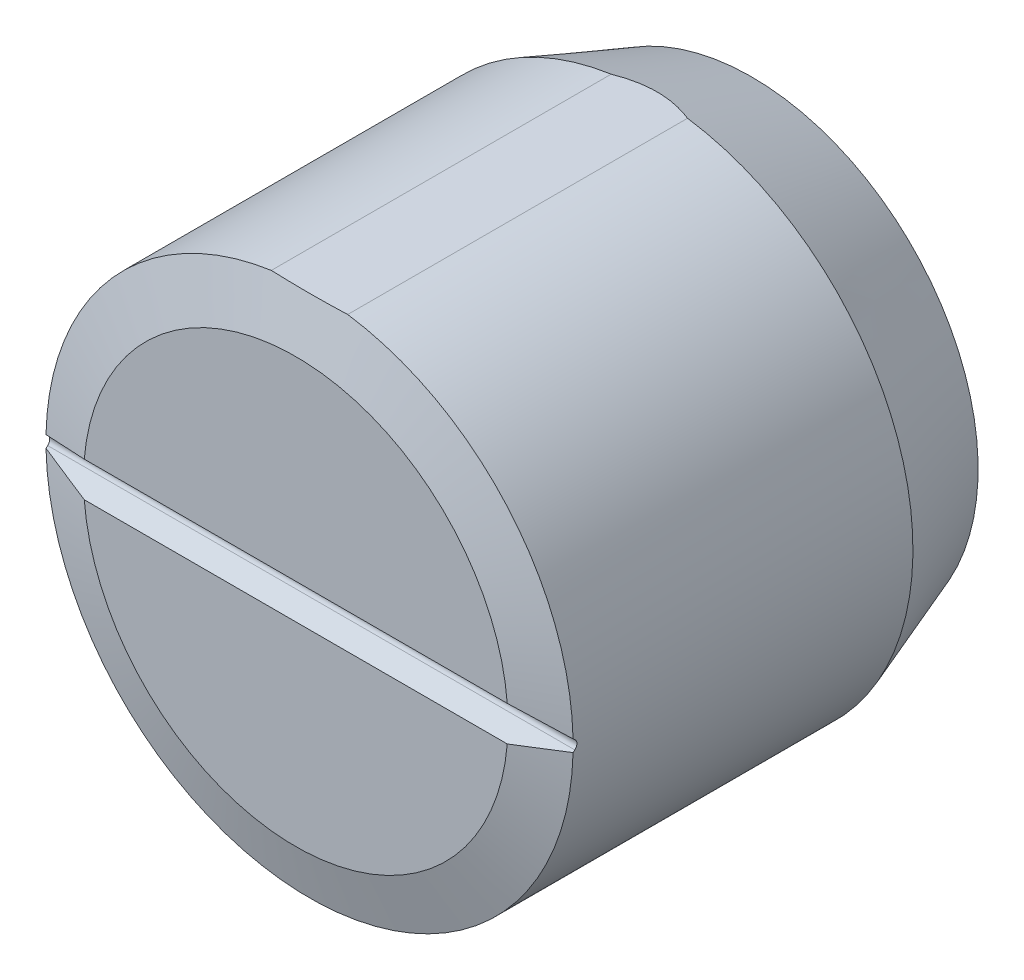
ISO-10303-21;
HEADER;
FILE_DESCRIPTION(('STEP AP214'),'2;1');
FILE_NAME('part.step','',(''),(''),'','','');
FILE_SCHEMA(('AUTOMOTIVE_DESIGN { 1 0 10303 214 1 1 1 1 }'));
ENDSEC;
DATA;
#1=APPLICATION_CONTEXT('core data for automotive mechanical design processes');
#2=APPLICATION_PROTOCOL_DEFINITION('international standard','automotive_design',2000,#1);
#3=PRODUCT_CONTEXT('',#1,'mechanical');
#4=PRODUCT('Part','Part','',(#3));
#5=PRODUCT_RELATED_PRODUCT_CATEGORY('part','',(#4));
#6=PRODUCT_DEFINITION_FORMATION('','',#4);
#7=PRODUCT_DEFINITION_CONTEXT('part definition',#1,'design');
#8=PRODUCT_DEFINITION('design','',#6,#7);
#9=PRODUCT_DEFINITION_SHAPE('','',#8);
#10=(LENGTH_UNIT() NAMED_UNIT(*) SI_UNIT(.MILLI.,.METRE.));
#11=(NAMED_UNIT(*) PLANE_ANGLE_UNIT() SI_UNIT($,.RADIAN.));
#12=(NAMED_UNIT(*) SI_UNIT($,.STERADIAN.) SOLID_ANGLE_UNIT());
#13=UNCERTAINTY_MEASURE_WITH_UNIT(LENGTH_MEASURE(1.E-05),#10,'distance_accuracy_value','');
#14=(GEOMETRIC_REPRESENTATION_CONTEXT(3) GLOBAL_UNCERTAINTY_ASSIGNED_CONTEXT((#13)) GLOBAL_UNIT_ASSIGNED_CONTEXT((#10,
#11,#12)) REPRESENTATION_CONTEXT('',''));
#15=CARTESIAN_POINT('',(0.,0.,0.));
#16=DIRECTION('',(0.,0.,1.));
#17=DIRECTION('',(1.,0.,0.));
#18=AXIS2_PLACEMENT_3D('',#15,#16,#17);
#19=CARTESIAN_POINT('',(0.,0.,15.1097491672833));
#20=DIRECTION('',(0.,0.,-1.));
#21=DIRECTION('',(-1.,0.,0.));
#22=AXIS2_PLACEMENT_3D('',#19,#20,#21);
#23=CONICAL_SURFACE('',#22,9.005,1.30899693899575);
#24=CARTESIAN_POINT('',(7.22436673413913,-0.600169059892802,15.5802));
#25=CARTESIAN_POINT('',(7.37277091732223,-0.567286950602729,15.5413000470452));
#26=CARTESIAN_POINT('',(7.52113153517502,-0.534323016319418,15.5023032940839));
#27=CARTESIAN_POINT('',(7.81777667592504,-0.468253253207628,15.4241419251118));
#28=CARTESIAN_POINT('',(7.96606119894645,-0.435147424611528,15.3849773093759));
#29=CARTESIAN_POINT('',(8.26256560088161,-0.368815536324618,15.3065058429919));
#30=CARTESIAN_POINT('',(8.41078547982616,-0.335589476691132,15.2671989924117));
#31=CARTESIAN_POINT('',(8.70716930626139,-0.269033044658679,15.1884618879247));
#32=CARTESIAN_POINT('',(8.8553332536603,-0.235702672089384,15.1490316338163));
#33=CARTESIAN_POINT('',(9.00347331411797,-0.202328164385701,15.1095491672834));
#34=B_SPLINE_CURVE_WITH_KNOTS('',3,(#24,#25,#26,#27,#28,#29,#30,#31,#32,#33),.UNSPECIFIED.,.F.,
.F.,(4,2,2,2,4),(0.,0.47070589152241,0.941411012469635,1.41211590901461,1.88282157454915),.UNSPECIFIED.);
#35=CARTESIAN_POINT('',(7.22512975662029,-0.600000000000045,15.58));
#36=VERTEX_POINT('',#35);
#37=CARTESIAN_POINT('',(9.00272291443868,-0.202497224278021,15.1097491672834));
#38=VERTEX_POINT('',#37);
#39=EDGE_CURVE('E196',#36,#38,#34,.T.);
#40=ORIENTED_EDGE('',*,*,#39,.F.);
#41=CARTESIAN_POINT('',(0.,0.,15.58));
#42=DIRECTION('',(0.,0.,-1.));
#43=DIRECTION('',(-1.,0.,0.));
#44=AXIS2_PLACEMENT_3D('',#41,#42,#43);
#45=CIRCLE('',#44,7.25);
#46=CARTESIAN_POINT('',(-7.22512975662029,-0.600000000000045,15.58));
#47=VERTEX_POINT('',#46);
#48=EDGE_CURVE('E241',#36,#47,#45,.T.);
#49=ORIENTED_EDGE('',*,*,#48,.T.);
#50=CARTESIAN_POINT('',(-9.00347331411791,-0.202328164385708,15.1095491672834));
#51=CARTESIAN_POINT('',(-8.85533325366024,-0.235702672089404,15.1490316338164));
#52=CARTESIAN_POINT('',(-8.70716930626131,-0.269033044658702,15.1884618879247));
#53=CARTESIAN_POINT('',(-8.41078547982606,-0.335589476691159,15.2671989924117));
#54=CARTESIAN_POINT('',(-8.26256560088149,-0.368815536324644,15.306505842992));
#55=CARTESIAN_POINT('',(-7.9660611989463,-0.435147424611569,15.3849773093759));
#56=CARTESIAN_POINT('',(-7.81777667592489,-0.468253253207683,15.4241419251118));
#57=CARTESIAN_POINT('',(-7.52113153517483,-0.534323016319447,15.5023032940839));
#58=CARTESIAN_POINT('',(-7.37277091732201,-0.567286950602718,15.5413000470453));
#59=CARTESIAN_POINT('',(-7.22436673413887,-0.600169059892687,15.5802000000001));
#60=B_SPLINE_CURVE_WITH_KNOTS('',3,(#50,#51,#52,#53,#54,#55,#56,#57,#58,#59),.UNSPECIFIED.,.F.,
.F.,(4,2,2,2,4),(0.,0.470705665534585,0.941410562079602,1.41211568302687,1.88282157454933),.UNSPECIFIED.);
#61=CARTESIAN_POINT('',(-9.00272291443868,-0.202497224277896,15.1097491672834));
#62=VERTEX_POINT('',#61);
#63=EDGE_CURVE('E190',#62,#47,#60,.T.);
#64=ORIENTED_EDGE('',*,*,#63,.F.);
#65=CARTESIAN_POINT('',(0.,0.,15.1097491672833));
#66=DIRECTION('',(0.,0.,-1.));
#67=DIRECTION('',(-1.,0.,0.));
#68=AXIS2_PLACEMENT_3D('',#65,#66,#67);
#69=CIRCLE('',#68,9.005);
#70=EDGE_CURVE('E128',#38,#62,#69,.T.);
#71=ORIENTED_EDGE('',*,*,#70,.F.);
#72=EDGE_LOOP('',(#40,#49,#64,#71));
#73=FACE_BOUND('',#72,.T.);
#74=ADVANCED_FACE('F41',(#73),#23,.T.);
#75=CARTESIAN_POINT('',(0.,7.24999999999997,15.58));
#76=DIRECTION('',(0.,0.,1.));
#77=DIRECTION('',(1.,0.,0.));
#78=AXIS2_PLACEMENT_3D('',#75,#76,#77);
#79=PLANE('',#78);
#80=DIRECTION('',(1.,0.,0.));
#81=VECTOR('',#80,1.);
#82=CARTESIAN_POINT('',(1.38777878078145E-13,-0.600000000000047,15.58));
#83=LINE('',#82,#81);
#84=EDGE_CURVE('E141',#47,#36,#83,.T.);
#85=ORIENTED_EDGE('',*,*,#84,.F.);
#86=ORIENTED_EDGE('',*,*,#48,.F.);
#87=EDGE_LOOP('',(#85,#86));
#88=FACE_BOUND('',#87,.T.);
#89=ADVANCED_FACE('F169',(#88),#79,.T.);
#90=CARTESIAN_POINT('',(0.,0.,0.));
#91=DIRECTION('',(0.,0.,-1.));
#92=DIRECTION('',(-1.,0.,0.));
#93=AXIS2_PLACEMENT_3D('',#90,#91,#92);
#94=PLANE('',#93);
#95=CARTESIAN_POINT('',(0.,0.,0.));
#96=DIRECTION('',(0.,0.,-1.));
#97=DIRECTION('',(-1.,0.,0.));
#98=AXIS2_PLACEMENT_3D('',#95,#96,#97);
#99=CIRCLE('',#98,7.73110418006829);
#100=CARTESIAN_POINT('',(-7.73110418006829,0.,0.));
#101=VERTEX_POINT('',#100);
#102=EDGE_CURVE('E136',#101,#101,#99,.T.);
#103=ORIENTED_EDGE('',*,*,#102,.T.);
#104=EDGE_LOOP('',(#103));
#105=FACE_BOUND('',#104,.T.);
#106=ADVANCED_FACE('F43',(#105),#94,.T.);
#107=CARTESIAN_POINT('',(0.,0.,0.));
#108=DIRECTION('',(0.,0.,1.));
#109=DIRECTION('',(1.,0.,0.));
#110=AXIS2_PLACEMENT_3D('',#107,#108,#109);
#111=CONICAL_SURFACE('',#110,7.73110418006829,0.349065850398866);
#112=CARTESIAN_POINT('',(-9.85202668718935,8.90999999999997,15.2549950201081));
#113=CARTESIAN_POINT('',(-9.73832319972021,8.90999999999997,15.0233033635091));
#114=CARTESIAN_POINT('',(-9.62391155739797,8.90999999999997,14.7919596300944));
#115=CARTESIAN_POINT('',(-9.39351714811486,8.90999999999997,14.3300512492619));
#116=CARTESIAN_POINT('',(-9.27753435506669,8.90999999999997,14.0994866148598));
#117=CARTESIAN_POINT('',(-8.92685090006894,8.90999999999997,13.4087987432727));
#118=CARTESIAN_POINT('',(-8.68956250736841,8.90999999999997,12.9499828200869));
#119=CARTESIAN_POINT('',(-8.20060385893398,8.90999999999998,12.0256592580023));
#120=CARTESIAN_POINT('',(-7.94872380468047,8.90999999999998,11.560262364858));
#121=CARTESIAN_POINT('',(-7.43385267489679,8.90999999999997,10.6358822500702));
#122=CARTESIAN_POINT('',(-7.17086666895079,8.90999999999996,10.1768962266744));
#123=CARTESIAN_POINT('',(-6.76535956781045,8.90999999999996,9.49473418767664));
#124=CARTESIAN_POINT('',(-6.62829643636828,8.90999999999997,9.26831186109794));
#125=CARTESIAN_POINT('',(-6.34994703769146,8.90999999999998,8.81808223552854));
#126=CARTESIAN_POINT('',(-6.20866092485748,8.90999999999997,8.5942748413458));
#127=CARTESIAN_POINT('',(-5.92097157982445,8.90999999999997,8.14950677044353));
#128=CARTESIAN_POINT('',(-5.77456125477976,8.90999999999997,7.92855066981121));
#129=CARTESIAN_POINT('',(-5.47596266356686,8.90999999999997,7.49058140838202));
#130=CARTESIAN_POINT('',(-5.32377472019753,8.90999999999997,7.27356802830179));
#131=CARTESIAN_POINT('',(-5.01392904483775,8.90999999999997,6.84643405707593));
#132=CARTESIAN_POINT('',(-4.85633283274131,8.90999999999997,6.6362690218073));
#133=CARTESIAN_POINT('',(-4.53300430930162,8.90999999999997,6.22216362081104));
#134=CARTESIAN_POINT('',(-4.36726988149461,8.90999999999997,6.01822489693125));
#135=CARTESIAN_POINT('',(-4.0264197882344,8.90999999999998,5.61918378235192));
#136=CARTESIAN_POINT('',(-3.85132886658601,8.90999999999998,5.42406038051527));
#137=CARTESIAN_POINT('',(-3.48930678484745,8.90999999999997,5.04520548421845));
#138=CARTESIAN_POINT('',(-3.30238425872756,8.90999999999995,4.86146587198599));
#139=CARTESIAN_POINT('',(-2.99532846896235,8.90999999999996,4.58361534765137));
#140=CARTESIAN_POINT('',(-2.88000580395285,8.90999999999997,4.48419248007644));
#141=CARTESIAN_POINT('',(-2.64380689821424,8.90999999999998,4.29204537322492));
#142=CARTESIAN_POINT('',(-2.52292893341572,8.90999999999997,4.19932323678034));
#143=CARTESIAN_POINT('',(-2.27554440435997,8.90999999999997,4.02261351873669));
#144=CARTESIAN_POINT('',(-2.14905923393758,8.90999999999998,3.93859623633899));
#145=CARTESIAN_POINT('',(-1.88973687463504,8.90999999999997,3.78111428422171));
#146=CARTESIAN_POINT('',(-1.7569040821598,8.90999999999996,3.70764244790472));
#147=CARTESIAN_POINT('',(-1.48044368533272,8.90999999999996,3.57170985264807));
#148=CARTESIAN_POINT('',(-1.33660855004627,8.90999999999997,3.50966439367904));
#149=CARTESIAN_POINT('',(-1.04251610703517,8.90999999999997,3.40273344604548));
#150=CARTESIAN_POINT('',(-0.892255136338415,8.90999999999996,3.35785789384378));
#151=CARTESIAN_POINT('',(-0.557078419023284,8.90999999999996,3.28172247812343));
#152=CARTESIAN_POINT('',(-0.371126019999049,8.90999999999997,3.25483361048744));
#153=CARTESIAN_POINT('',(0.00256491954699891,8.90999999999997,3.23361621423221));
#154=CARTESIAN_POINT('',(0.190302361130124,8.90999999999996,3.23926880280079));
#155=CARTESIAN_POINT('',(0.561520598463996,8.90999999999996,3.28226514230495));
#156=CARTESIAN_POINT('',(0.745010647559128,8.90999999999998,3.31953167704147));
#157=CARTESIAN_POINT('',(1.10413489125104,8.90999999999997,3.4213376981751));
#158=CARTESIAN_POINT('',(1.27976537263831,8.90999999999996,3.48588992821065));
#159=CARTESIAN_POINT('',(1.59125567250086,8.90999999999996,3.62338556021646));
#160=CARTESIAN_POINT('',(1.7286865675411,8.90999999999997,3.69286920531092));
#161=CARTESIAN_POINT('',(1.99694628939248,8.90999999999998,3.84369744549519));
#162=CARTESIAN_POINT('',(2.12777037730051,8.90999999999997,3.925050395952));
#163=CARTESIAN_POINT('',(2.3842848357777,8.90999999999997,4.09799143261248));
#164=CARTESIAN_POINT('',(2.50991181302054,8.90999999999998,4.18967259103326));
#165=CARTESIAN_POINT('',(2.75515148065709,8.90999999999998,4.38059571683231));
#166=CARTESIAN_POINT('',(2.87476654607346,8.90999999999997,4.47983465889021));
#167=CARTESIAN_POINT('',(3.16745439357251,8.90999999999997,4.73578818181259));
#168=CARTESIAN_POINT('',(3.33717984327115,8.90999999999998,4.89632184015375));
#169=CARTESIAN_POINT('',(3.66662022917599,8.90999999999998,5.22741695244774));
#170=CARTESIAN_POINT('',(3.82632893444507,8.90999999999998,5.39798452266247));
#171=CARTESIAN_POINT('',(4.13784101034586,8.90999999999998,5.7471876610858));
#172=CARTESIAN_POINT('',(4.28961580244509,8.90999999999998,5.92584857660066));
#173=CARTESIAN_POINT('',(4.58606344684487,8.90999999999998,6.2889752225291));
#174=CARTESIAN_POINT('',(4.73073534625432,8.90999999999997,6.47344172637559));
#175=CARTESIAN_POINT('',(5.00540129919298,8.90999999999998,6.83551476718275));
#176=CARTESIAN_POINT('',(5.13575209384709,8.90999999999998,7.01285187600863));
#177=CARTESIAN_POINT('',(5.39189163321045,8.90999999999997,7.37080626547569));
#178=CARTESIAN_POINT('',(5.51767997069381,8.90999999999996,7.55142383676858));
#179=CARTESIAN_POINT('',(5.76424386805758,8.90999999999999,7.913809677761));
#180=CARTESIAN_POINT('',(5.88505282803088,8.91000000000002,8.09555529294848));
#181=CARTESIAN_POINT('',(6.12321065489872,8.90999999999993,8.46123546189821));
#182=CARTESIAN_POINT('',(6.24056040168765,8.90999999999981,8.64516944201943));
#183=CARTESIAN_POINT('',(6.35643071534644,8.90999999999952,8.83001663249682));
#184=B_SPLINE_CURVE_WITH_KNOTS('',3,(#112,#113,#114,#115,#116,#117,#118,#119,#120,#121,#122,
#123,#124,#125,#126,#127,#128,#129,#130,#131,#132,#133,#134,#135,#136,#137,#138,#139,#140,#141,
#142,#143,#144,#145,#146,#147,#148,#149,#150,#151,#152,#153,#154,#155,#156,#157,#158,#159,#160,
#161,#162,#163,#164,#165,#166,#167,#168,#169,#170,#171,#172,#173,#174,#175,#176,#177,#178,#179,
#180,#181,#182,#183),.UNSPECIFIED.,.F.,.F.,(4,2,2,2,2,2,2,2,2,2,2,2,2,2,2,2,2,2,2,2,2,2,2,2,2,2,
2,2,2,2,2,2,2,2,2,4),(0.,0.774261954853833,1.5485367813076,3.09809249411595,4.68554241127188,
6.27227536913526,7.06626668493813,7.86022900625234,8.65533752692978,9.45040168962319,
10.2383137062572,11.0264317277016,11.812559788227,12.5981206513432,13.0547152544709,
13.5114525299999,13.9665762102659,14.4213891127385,14.8903989993721,15.359679899459,
15.9206144412045,16.4812235226049,17.0404672610214,17.5999724803454,18.0613046928323,
18.5229632400234,18.9891771041258,19.4552053176551,20.1554565662914,20.8561391736347,
21.5591927336377,22.2623403557505,22.9225292492604,23.5827769241947,24.2374400786621,
24.8919352486842),.UNSPECIFIED.);
#185=CARTESIAN_POINT('',(1.30457847598361,8.90999999999952,3.49999999999995));
#186=VERTEX_POINT('',#185);
#187=CARTESIAN_POINT('',(-1.30457847598378,8.90999999999996,3.49999999999995));
#188=VERTEX_POINT('',#187);
#189=EDGE_CURVE('E211',#186,#188,#184,.F.);
#190=ORIENTED_EDGE('',*,*,#189,.F.);
#191=CARTESIAN_POINT('',(0.,0.,3.49999999999995));
#192=DIRECTION('',(0.,0.,-1.));
#193=DIRECTION('',(-1.,0.,0.));
#194=AXIS2_PLACEMENT_3D('',#191,#192,#193);
#195=CIRCLE('',#194,9.005);
#196=EDGE_CURVE('E123',#186,#188,#195,.T.);
#197=ORIENTED_EDGE('',*,*,#196,.T.);
#198=EDGE_LOOP('',(#190,#197));
#199=FACE_BOUND('',#198,.T.);
#200=ORIENTED_EDGE('',*,*,#102,.F.);
#201=EDGE_LOOP('',(#200));
#202=FACE_BOUND('',#201,.T.);
#203=ADVANCED_FACE('F220',(#199,#202),#111,.T.);
#204=CARTESIAN_POINT('',(0.,0.,0.));
#205=DIRECTION('',(0.,0.,-1.));
#206=DIRECTION('',(-1.,0.,0.));
#207=AXIS2_PLACEMENT_3D('',#204,#205,#206);
#208=CYLINDRICAL_SURFACE('',#207,9.005);
#209=DIRECTION('',(0.,0.,-1.));
#210=VECTOR('',#209,1.);
#211=CARTESIAN_POINT('',(-1.30457847598378,8.90999999999997,0.));
#212=LINE('',#211,#210);
#213=CARTESIAN_POINT('',(-1.30457847598378,8.90999999999997,15.1097491672834));
#214=VERTEX_POINT('',#213);
#215=EDGE_CURVE('E61',#188,#214,#212,.F.);
#216=ORIENTED_EDGE('',*,*,#215,.F.);
#217=ORIENTED_EDGE('',*,*,#196,.F.);
#218=DIRECTION('',(0.,0.,-1.));
#219=VECTOR('',#218,1.);
#220=CARTESIAN_POINT('',(1.30457847598367,8.90999999999952,0.));
#221=LINE('',#220,#219);
#222=CARTESIAN_POINT('',(1.30457847598361,8.90999999999952,15.1097491672837));
#223=VERTEX_POINT('',#222);
#224=EDGE_CURVE('E111',#223,#186,#221,.T.);
#225=ORIENTED_EDGE('',*,*,#224,.F.);
#226=CARTESIAN_POINT('',(9.00272291443874,0.202497224277898,15.1097491672834));
#227=VERTEX_POINT('',#226);
#228=EDGE_CURVE('E121',#223,#227,#69,.T.);
#229=ORIENTED_EDGE('',*,*,#228,.T.);
#230=CARTESIAN_POINT('',(0.,0.,14.8701923788647));
#231=DIRECTION('',(0.,0.763707940790422,-0.645561911185635));
#232=DIRECTION('',(0.,-0.645561911185634,-0.763707940790424));
#233=AXIS2_PLACEMENT_3D('',#230,#231,#232);
#234=ELLIPSE('',#233,13.9490881416183,9.005);
#235=CARTESIAN_POINT('',(9.00370451576718,0.152741588158136,15.0508876177629));
#236=VERTEX_POINT('',#235);
#237=EDGE_CURVE('E250',#236,#227,#234,.F.);
#238=ORIENTED_EDGE('',*,*,#237,.F.);
#239=CARTESIAN_POINT('',(9.00370451576718,-0.152741588158152,15.0508876177629));
#240=CARTESIAN_POINT('',(9.00382785449455,-0.145485461516833,15.0422887523417));
#241=CARTESIAN_POINT('',(9.00395448059267,-0.137491962043754,15.03431694995));
#242=CARTESIAN_POINT('',(9.00420056491583,-0.120290631982083,15.0198266527458));
#243=CARTESIAN_POINT('',(9.00432002822644,-0.111083678159597,15.0133071176796));
#244=CARTESIAN_POINT('',(9.0045383108549,-0.0917002537795633,15.0019050095292));
#245=CARTESIAN_POINT('',(9.00463712068713,-0.0815233408546724,14.9970231879857));
#246=CARTESIAN_POINT('',(9.00480291510115,-0.060496368130665,14.9890377764883));
#247=CARTESIAN_POINT('',(9.00486990557044,-0.04964643328004,14.9859338575502));
#248=CARTESIAN_POINT('',(9.0049645208678,-0.0275800666279605,14.9815918532155));
#249=CARTESIAN_POINT('',(9.00499214876594,-0.0163636634788681,14.9803536223047));
#250=CARTESIAN_POINT('',(9.00500493720603,0.00611850463255241,14.9797776033208));
#251=CARTESIAN_POINT('',(9.00499009532122,0.0173842723788772,14.9804399238464));
#252=CARTESIAN_POINT('',(9.00491962768836,0.0396400122364273,14.9836456523517));
#253=CARTESIAN_POINT('',(9.00486401844282,0.0506300940833742,14.9861882991842));
#254=CARTESIAN_POINT('',(9.00471826192663,0.072032396876099,14.9930835651275));
#255=CARTESIAN_POINT('',(9.00462809983383,0.0824443676316984,14.9974369610649));
#256=CARTESIAN_POINT('',(9.00442332477357,0.10239823098556,15.007833262838));
#257=CARTESIAN_POINT('',(9.0043086881504,0.111939268960968,15.013877805008));
#258=CARTESIAN_POINT('',(9.00406813559458,0.12985439208539,15.0274753259705));
#259=CARTESIAN_POINT('',(9.00394224438615,0.138230936702547,15.0350250410108));
#260=CARTESIAN_POINT('',(9.0037798613365,0.14825239835924,15.0457125926853));
#261=CARTESIAN_POINT('',(9.00374201595107,0.150531413772268,15.0482720862612));
#262=CARTESIAN_POINT('',(9.00370451576718,0.152741588158136,15.0508876177629));
#263=B_SPLINE_CURVE_WITH_KNOTS('',3,(#239,#240,#241,#242,#243,#244,#245,#246,#247,#248,#249,
#250,#251,#252,#253,#254,#255,#256,#257,#258,#259,#260,#261,#262),.UNSPECIFIED.,.F.,.F.,(4,2,2,
2,2,2,2,2,2,2,2,4),(0.,0.0337111285118475,0.0673980316557301,0.101100372513311,
0.134796475051494,0.168489949331306,0.202185348915176,0.235867116221424,0.269563348216738,
0.303292297744346,0.336948891100301,0.34722579177601),.UNSPECIFIED.);
#264=CARTESIAN_POINT('',(9.00370451576724,-0.152741588158159,15.0508876177629));
#265=VERTEX_POINT('',#264);
#266=EDGE_CURVE('E143',#265,#236,#263,.T.);
#267=ORIENTED_EDGE('',*,*,#266,.F.);
#268=CARTESIAN_POINT('',(0.,0.,14.8701923788647));
#269=DIRECTION('',(0.,-0.76370794079042,-0.645561911185638));
#270=DIRECTION('',(0.,0.645561911185636,-0.763707940790422));
#271=AXIS2_PLACEMENT_3D('',#268,#269,#270);
#272=ELLIPSE('',#271,13.9490881416183,9.005);
#273=EDGE_CURVE('E201',#38,#265,#272,.F.);
#274=ORIENTED_EDGE('',*,*,#273,.F.);
#275=ORIENTED_EDGE('',*,*,#70,.T.);
#276=CARTESIAN_POINT('',(-9.00370451576718,-0.152741588158143,15.0508876177629));
#277=VERTEX_POINT('',#276);
#278=EDGE_CURVE('E202',#277,#62,#272,.F.);
#279=ORIENTED_EDGE('',*,*,#278,.F.);
#280=CARTESIAN_POINT('',(-9.00370451576725,0.152741588157696,15.0508876177629));
#281=CARTESIAN_POINT('',(-9.00382785449458,0.145485461516552,15.0422887523416));
#282=CARTESIAN_POINT('',(-9.00395448059268,0.137491962043557,15.0343169499498));
#283=CARTESIAN_POINT('',(-9.00420056491583,0.120290631982001,15.0198266527458));
#284=CARTESIAN_POINT('',(-9.00432002822644,0.111083678159549,15.0133071176796));
#285=CARTESIAN_POINT('',(-9.0045383108549,0.091700253779494,15.0019050095292));
#286=CARTESIAN_POINT('',(-9.00463712068713,0.0815233408545343,14.9970231879856));
#287=CARTESIAN_POINT('',(-9.00480291510116,0.0604963681303355,14.9890377764882));
#288=CARTESIAN_POINT('',(-9.00486990557045,0.0496464332795871,14.9859338575502));
#289=CARTESIAN_POINT('',(-9.00496452086784,0.0275800666274012,14.9815918532155));
#290=CARTESIAN_POINT('',(-9.00499214876602,0.0163636634783293,14.9803536223047));
#291=CARTESIAN_POINT('',(-9.00500493720596,-0.00611850463305569,14.9797776033208));
#292=CARTESIAN_POINT('',(-9.00499009532098,-0.0173842723793655,14.9804399238464));
#293=CARTESIAN_POINT('',(-9.00491962768813,-0.0396400122368478,14.9836456523518));
#294=CARTESIAN_POINT('',(-9.00486401844278,-0.050630094083742,14.9861882991843));
#295=CARTESIAN_POINT('',(-9.00471826192666,-0.0720323968764953,14.9930835651276));
#296=CARTESIAN_POINT('',(-9.00462809983374,-0.0824443676321747,14.9974369610648));
#297=CARTESIAN_POINT('',(-9.00442332477344,-0.102398230985973,15.007833262838));
#298=CARTESIAN_POINT('',(-9.00430868815036,-0.111939268961236,15.0138778050082));
#299=CARTESIAN_POINT('',(-9.00406813559461,-0.129854392085749,15.0274753259707));
#300=CARTESIAN_POINT('',(-9.00394224438615,-0.138230936703142,15.0350250410108));
#301=CARTESIAN_POINT('',(-9.0037798613365,-0.148252398359577,15.0457125926852));
#302=CARTESIAN_POINT('',(-9.00374201595107,-0.150531413772464,15.0482720862612));
#303=CARTESIAN_POINT('',(-9.00370451576718,-0.152741588158143,15.0508876177629));
#304=B_SPLINE_CURVE_WITH_KNOTS('',3,(#280,#281,#282,#283,#284,#285,#286,#287,#288,#289,#290,
#291,#292,#293,#294,#295,#296,#297,#298,#299,#300,#301,#302,#303),.UNSPECIFIED.,.F.,.F.,(4,2,2,
2,2,2,2,2,2,2,2,4),(0.,0.0337111285117229,0.0673980316554016,0.101100372513234,0.13479647505171,
0.168489949331495,0.202185348915288,0.23586711622148,0.269563348216821,0.303292297744459,
0.33694889110034,0.347225791775758),.UNSPECIFIED.);
#305=CARTESIAN_POINT('',(-9.00370451576725,0.152741588157696,15.0508876177629));
#306=VERTEX_POINT('',#305);
#307=EDGE_CURVE('E55',#306,#277,#304,.T.);
#308=ORIENTED_EDGE('',*,*,#307,.F.);
#309=CARTESIAN_POINT('',(-9.00272291443868,0.202497224277556,15.1097491672834));
#310=VERTEX_POINT('',#309);
#311=EDGE_CURVE('E248',#310,#306,#234,.F.);
#312=ORIENTED_EDGE('',*,*,#311,.F.);
#313=EDGE_CURVE('E127',#310,#214,#69,.T.);
#314=ORIENTED_EDGE('',*,*,#313,.T.);
#315=EDGE_LOOP('',(#216,#217,#225,#229,#238,#267,#274,#275,#279,#308,#312,#314));
#316=FACE_BOUND('',#315,.T.);
#317=ADVANCED_FACE('F119',(#316),#208,.T.);
#318=CARTESIAN_POINT('',(-10.0192313656519,8.90999999999997,13.9299825307054));
#319=CARTESIAN_POINT('',(-9.64265363949708,8.90999999999997,14.005351173473));
#320=CARTESIAN_POINT('',(-9.26571786504101,8.90999999999997,14.0789776778425));
#321=CARTESIAN_POINT('',(-8.510968545154,8.90999999999997,14.2218230432374));
#322=CARTESIAN_POINT('',(-8.13315490279017,8.90999999999997,14.2910413909582));
#323=CARTESIAN_POINT('',(-7.37565436567581,8.90999999999997,14.4242911848204));
#324=CARTESIAN_POINT('',(-6.99596514968397,8.90999999999997,14.4883095881391));
#325=CARTESIAN_POINT('',(-6.23555854352244,8.90999999999997,14.6097755355017));
#326=CARTESIAN_POINT('',(-5.85484118092559,8.90999999999997,14.6672232540017));
#327=CARTESIAN_POINT('',(-4.7206866636274,8.90999999999997,14.8262896210399));
#328=CARTESIAN_POINT('',(-3.96552296592474,8.90999999999997,14.9164085135672));
#329=CARTESIAN_POINT('',(-2.83030088221788,8.90999999999997,15.0194610906526));
#330=CARTESIAN_POINT('',(-2.4516832304517,8.90999999999998,15.048450747755));
#331=CARTESIAN_POINT('',(-1.69370961407065,8.90999999999997,15.0944648942942));
#332=CARTESIAN_POINT('',(-1.31435366147319,8.90999999999997,15.1114895768796));
#333=CARTESIAN_POINT('',(-0.554213826974861,8.90999999999997,15.1327406896752));
#334=CARTESIAN_POINT('',(-0.173428924443566,8.90999999999997,15.1369310881416));
#335=CARTESIAN_POINT('',(0.588060026570521,8.90999999999998,15.1321852441974));
#336=CARTESIAN_POINT('',(0.968764074613531,8.90999999999997,15.1232489321292));
#337=CARTESIAN_POINT('',(1.7300650542743,8.90999999999997,15.0927099456286));
#338=CARTESIAN_POINT('',(2.11066143052558,8.90999999999998,15.0710936615605));
#339=CARTESIAN_POINT('',(2.87100460393349,8.90999999999998,15.0162449903309));
#340=CARTESIAN_POINT('',(3.2507513983154,8.90999999999998,14.9830125652867));
#341=CARTESIAN_POINT('',(4.01394571895888,8.90999999999998,14.9058596744867));
#342=CARTESIAN_POINT('',(4.39738008438758,8.90999999999998,14.861810657072));
#343=CARTESIAN_POINT('',(5.16313012424169,8.90999999999998,14.7648086882997));
#344=CARTESIAN_POINT('',(5.54544573781431,8.90999999999998,14.7118552614341));
#345=CARTESIAN_POINT('',(6.30818203021876,8.90999999999998,14.5986637129567));
#346=CARTESIAN_POINT('',(6.68860498895648,8.90999999999998,14.5384407929872));
#347=CARTESIAN_POINT('',(7.44835973303659,8.90999999999997,14.4118990581554));
#348=CARTESIAN_POINT('',(7.82769172426339,8.90999999999997,14.3455814835881));
#349=CARTESIAN_POINT('',(8.20656259023708,8.90999999999996,14.2768414090589));
#350=B_SPLINE_CURVE_WITH_KNOTS('',3,(#318,#319,#320,#321,#322,#323,#324,#325,#326,#327,#328,
#329,#330,#331,#332,#333,#334,#335,#336,#337,#338,#339,#340,#341,#342,#343,#344,#345,#346,#347,
#348,#349),.UNSPECIFIED.,.F.,.F.,(4,2,2,2,2,2,2,2,2,2,2,2,2,2,2,4),(0.,1.1521460935192,
2.30442610350558,3.459512396371,4.61456801378317,6.89503937579688,8.03406148156572,
9.17306519986892,10.3152637083395,11.4574682779693,12.6009010447267,13.7443375404898,
14.9020836643408,16.0598916330936,17.2153190763479,18.3705119023711),.UNSPECIFIED.);
#351=EDGE_CURVE('E11',#214,#223,#350,.T.);
#352=ORIENTED_EDGE('',*,*,#351,.F.);
#353=ORIENTED_EDGE('',*,*,#313,.F.);
#354=CARTESIAN_POINT('',(-7.22436673413898,0.6001690598919,15.5802000000001));
#355=CARTESIAN_POINT('',(-7.37277091732219,0.567286950602417,15.5413000470453));
#356=CARTESIAN_POINT('',(-7.52113153517503,0.534323016319338,15.5023032940839));
#357=CARTESIAN_POINT('',(-7.81777667592507,0.468253253207714,15.4241419251117));
#358=CARTESIAN_POINT('',(-7.96606119894645,0.435147424611548,15.3849773093759));
#359=CARTESIAN_POINT('',(-8.26256560088159,0.368815536324617,15.3065058429919));
#360=CARTESIAN_POINT('',(-8.41078547982614,0.33558947669118,15.2671989924117));
#361=CARTESIAN_POINT('',(-8.70716930626134,0.269033044658664,15.1884618879247));
#362=CARTESIAN_POINT('',(-8.85533325366022,0.235702672089259,15.1490316338164));
#363=CARTESIAN_POINT('',(-9.0034733141178,0.202328164385254,15.1095491672834));
#364=B_SPLINE_CURVE_WITH_KNOTS('',3,(#354,#355,#356,#357,#358,#359,#360,#361,#362,#363),
.UNSPECIFIED.,.F.,.F.,(4,2,2,2,4),(0.,0.470705891522385,0.941411012469584,1.41211590901453,
1.88282157454905),.UNSPECIFIED.);
#365=CARTESIAN_POINT('',(-7.22512975662029,0.599999999999603,15.58));
#366=VERTEX_POINT('',#365);
#367=EDGE_CURVE('E184',#366,#310,#364,.T.);
#368=ORIENTED_EDGE('',*,*,#367,.F.);
#369=CARTESIAN_POINT('',(7.22512975662046,0.599999999999596,15.58));
#370=VERTEX_POINT('',#369);
#371=EDGE_CURVE('E131',#366,#370,#45,.T.);
#372=ORIENTED_EDGE('',*,*,#371,.T.);
#373=CARTESIAN_POINT('',(9.00347331411791,0.202328164385248,15.1095491672834));
#374=CARTESIAN_POINT('',(8.85533325366031,0.235702672089237,15.1490316338163));
#375=CARTESIAN_POINT('',(8.70716930626143,0.269033044658644,15.1884618879247));
#376=CARTESIAN_POINT('',(8.41078547982621,0.33558947669117,15.2671989924117));
#377=CARTESIAN_POINT('',(8.26256560088165,0.368815536324616,15.3065058429919));
#378=CARTESIAN_POINT('',(7.96606119894648,0.435147424611533,15.3849773093758));
#379=CARTESIAN_POINT('',(7.81777667592509,0.468253253207679,15.4241419251117));
#380=CARTESIAN_POINT('',(7.52113153517504,0.53432301631937,15.5023032940839));
#381=CARTESIAN_POINT('',(7.37277091732221,0.567286950602538,15.5413000470452));
#382=CARTESIAN_POINT('',(7.22436673413904,0.600169059892233,15.5802));
#383=B_SPLINE_CURVE_WITH_KNOTS('',3,(#373,#374,#375,#376,#377,#378,#379,#380,#381,#382),
.UNSPECIFIED.,.F.,.F.,(4,2,2,2,4),(0.,0.470705665534544,0.941410562079522,1.41211568302675,
1.88282157454917),.UNSPECIFIED.);
#384=EDGE_CURVE('E69',#227,#370,#383,.T.);
#385=ORIENTED_EDGE('',*,*,#384,.F.);
#386=ORIENTED_EDGE('',*,*,#228,.F.);
#387=EDGE_LOOP('',(#352,#353,#368,#372,#385,#386));
#388=FACE_BOUND('',#387,.T.);
#389=ADVANCED_FACE('F125',(#388),#23,.T.);
#390=DIRECTION('',(-1.,0.,0.));
#391=VECTOR('',#390,1.);
#392=CARTESIAN_POINT('',(1.38777878078145E-13,0.600000000000042,15.58));
#393=LINE('',#392,#391);
#394=EDGE_CURVE('E139',#370,#366,#393,.T.);
#395=ORIENTED_EDGE('',*,*,#394,.F.);
#396=ORIENTED_EDGE('',*,*,#371,.F.);
#397=EDGE_LOOP('',(#395,#396));
#398=FACE_BOUND('',#397,.T.);
#399=ADVANCED_FACE('F161',(#398),#79,.T.);
#400=CARTESIAN_POINT('',(-9.00499999999996,0.,15.18));
#401=DIRECTION('',(1.,0.,0.));
#402=DIRECTION('',(0.,0.,-1.));
#403=AXIS2_PLACEMENT_3D('',#400,#401,#402);
#404=CYLINDRICAL_SURFACE('',#403,0.2);
#405=DIRECTION('',(1.,0.,0.));
#406=VECTOR('',#405,1.);
#407=CARTESIAN_POINT('',(-9.00499999999996,0.152741588158034,15.0508876177629));
#408=LINE('',#407,#406);
#409=EDGE_CURVE('E218',#306,#236,#408,.T.);
#410=ORIENTED_EDGE('',*,*,#409,.F.);
#411=ORIENTED_EDGE('',*,*,#307,.T.);
#412=DIRECTION('',(1.,0.,0.));
#413=VECTOR('',#412,1.);
#414=CARTESIAN_POINT('',(-9.00499999999996,-0.152741588158029,15.0508876177629));
#415=LINE('',#414,#413);
#416=EDGE_CURVE('E219',#277,#265,#415,.T.);
#417=ORIENTED_EDGE('',*,*,#416,.T.);
#418=ORIENTED_EDGE('',*,*,#266,.T.);
#419=EDGE_LOOP('',(#410,#411,#417,#418));
#420=FACE_BOUND('',#419,.T.);
#421=ADVANCED_FACE('F155',(#420),#404,.F.);
#422=CARTESIAN_POINT('',(-9.00499999999996,-0.152741588158029,15.0508876177629));
#423=DIRECTION('',(0.,-0.76370794079042,-0.645561911185638));
#424=DIRECTION('',(0.,0.645561911185636,-0.763707940790422));
#425=AXIS2_PLACEMENT_3D('',#422,#423,#424);
#426=PLANE('',#425);
#427=ORIENTED_EDGE('',*,*,#273,.T.);
#428=ORIENTED_EDGE('',*,*,#416,.F.);
#429=ORIENTED_EDGE('',*,*,#278,.T.);
#430=ORIENTED_EDGE('',*,*,#63,.T.);
#431=ORIENTED_EDGE('',*,*,#84,.T.);
#432=ORIENTED_EDGE('',*,*,#39,.T.);
#433=EDGE_LOOP('',(#427,#428,#429,#430,#431,#432));
#434=FACE_BOUND('',#433,.T.);
#435=ADVANCED_FACE('F160',(#434),#426,.F.);
#436=CARTESIAN_POINT('',(-9.00499999999996,0.152741588158034,15.0508876177629));
#437=DIRECTION('',(0.,0.763707940790422,-0.645561911185635));
#438=DIRECTION('',(0.,0.645561911185634,0.763707940790424));
#439=AXIS2_PLACEMENT_3D('',#436,#437,#438);
#440=PLANE('',#439);
#441=ORIENTED_EDGE('',*,*,#311,.T.);
#442=ORIENTED_EDGE('',*,*,#409,.T.);
#443=ORIENTED_EDGE('',*,*,#237,.T.);
#444=ORIENTED_EDGE('',*,*,#384,.T.);
#445=ORIENTED_EDGE('',*,*,#394,.T.);
#446=ORIENTED_EDGE('',*,*,#367,.T.);
#447=EDGE_LOOP('',(#441,#442,#443,#444,#445,#446));
#448=FACE_BOUND('',#447,.T.);
#449=ADVANCED_FACE('F163',(#448),#440,.F.);
#450=CARTESIAN_POINT('',(-3.76434367986458,8.90999999999997,0.));
#451=DIRECTION('',(0.,-0.999999999999998,0.));
#452=DIRECTION('',(0.,0.,-1.));
#453=AXIS2_PLACEMENT_3D('',#450,#451,#452);
#454=PLANE('',#453);
#455=ORIENTED_EDGE('',*,*,#189,.T.);
#456=ORIENTED_EDGE('',*,*,#215,.T.);
#457=ORIENTED_EDGE('',*,*,#351,.T.);
#458=ORIENTED_EDGE('',*,*,#224,.T.);
#459=EDGE_LOOP('',(#455,#456,#457,#458));
#460=FACE_BOUND('',#459,.T.);
#461=ADVANCED_FACE('F110',(#460),#454,.F.);
#462=CLOSED_SHELL('',(#74,#89,#106,#203,#317,#389,#399,#421,#435,#449,#461));
#463=MANIFOLD_SOLID_BREP('B2',#462);
#464=ADVANCED_BREP_SHAPE_REPRESENTATION('',(#18,#463),#14);
#465=SHAPE_DEFINITION_REPRESENTATION(#9,#464);
ENDSEC;
END-ISO-10303-21;
